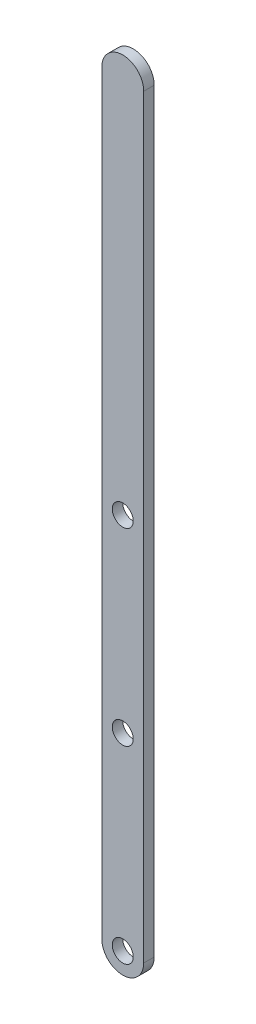
ISO-10303-21;
HEADER;
FILE_DESCRIPTION(('STEP AP214'),'2;1');
FILE_NAME('part.step','',(''),(''),'','','');
FILE_SCHEMA(('AUTOMOTIVE_DESIGN { 1 0 10303 214 1 1 1 1 }'));
ENDSEC;
DATA;
#1=APPLICATION_CONTEXT('core data for automotive mechanical design processes');
#2=APPLICATION_PROTOCOL_DEFINITION('international standard','automotive_design',2000,#1);
#3=PRODUCT_CONTEXT('',#1,'mechanical');
#4=PRODUCT('Part','Part','',(#3));
#5=PRODUCT_RELATED_PRODUCT_CATEGORY('part','',(#4));
#6=PRODUCT_DEFINITION_FORMATION('','',#4);
#7=PRODUCT_DEFINITION_CONTEXT('part definition',#1,'design');
#8=PRODUCT_DEFINITION('design','',#6,#7);
#9=PRODUCT_DEFINITION_SHAPE('','',#8);
#10=(LENGTH_UNIT() NAMED_UNIT(*) SI_UNIT(.MILLI.,.METRE.));
#11=(NAMED_UNIT(*) PLANE_ANGLE_UNIT() SI_UNIT($,.RADIAN.));
#12=(NAMED_UNIT(*) SI_UNIT($,.STERADIAN.) SOLID_ANGLE_UNIT());
#13=UNCERTAINTY_MEASURE_WITH_UNIT(LENGTH_MEASURE(1.E-05),#10,'distance_accuracy_value','');
#14=(GEOMETRIC_REPRESENTATION_CONTEXT(3) GLOBAL_UNCERTAINTY_ASSIGNED_CONTEXT((#13)) GLOBAL_UNIT_ASSIGNED_CONTEXT((#10,
#11,#12)) REPRESENTATION_CONTEXT('',''));
#15=CARTESIAN_POINT('',(0.,0.,0.));
#16=DIRECTION('',(0.,0.,1.));
#17=DIRECTION('',(1.,0.,0.));
#18=AXIS2_PLACEMENT_3D('',#15,#16,#17);
#19=CARTESIAN_POINT('',(0.,-457.2,12.7));
#20=DIRECTION('',(0.,0.,1.));
#21=DIRECTION('',(1.,0.,0.));
#22=AXIS2_PLACEMENT_3D('',#19,#20,#21);
#23=PLANE('',#22);
#24=CARTESIAN_POINT('',(0.,-457.2,12.7));
#25=DIRECTION('',(0.,0.,1.));
#26=DIRECTION('',(1.,0.,0.));
#27=AXIS2_PLACEMENT_3D('',#24,#25,#26);
#28=CIRCLE('',#27,12.7);
#29=CARTESIAN_POINT('',(12.7,-457.2,12.7));
#30=VERTEX_POINT('',#29);
#31=EDGE_CURVE('E125',#30,#30,#28,.T.);
#32=ORIENTED_EDGE('',*,*,#31,.F.);
#33=EDGE_LOOP('',(#32));
#34=FACE_BOUND('',#33,.T.);
#35=CARTESIAN_POINT('',(0.,-457.2,12.7));
#36=DIRECTION('',(0.,0.,1.));
#37=DIRECTION('',(1.,0.,0.));
#38=AXIS2_PLACEMENT_3D('',#35,#36,#37);
#39=CIRCLE('',#38,25.3999999999999);
#40=CARTESIAN_POINT('',(-25.3999999999999,-457.2,12.7));
#41=VERTEX_POINT('',#40);
#42=CARTESIAN_POINT('',(25.3999999999999,-457.2,12.7));
#43=VERTEX_POINT('',#42);
#44=EDGE_CURVE('E91',#41,#43,#39,.T.);
#45=ORIENTED_EDGE('',*,*,#44,.T.);
#46=DIRECTION('',(0.,1.,0.));
#47=VECTOR('',#46,1.);
#48=CARTESIAN_POINT('',(25.3999999999999,0.,12.7));
#49=LINE('',#48,#47);
#50=CARTESIAN_POINT('',(25.3999999999999,457.2,12.7));
#51=VERTEX_POINT('',#50);
#52=EDGE_CURVE('E85',#43,#51,#49,.T.);
#53=ORIENTED_EDGE('',*,*,#52,.T.);
#54=CARTESIAN_POINT('',(0.,457.2,12.7));
#55=DIRECTION('',(0.,0.,1.));
#56=DIRECTION('',(1.,0.,0.));
#57=AXIS2_PLACEMENT_3D('',#54,#55,#56);
#58=CIRCLE('',#57,25.3999999999999);
#59=CARTESIAN_POINT('',(-25.3999999999999,457.2,12.7));
#60=VERTEX_POINT('',#59);
#61=EDGE_CURVE('E88',#51,#60,#58,.T.);
#62=ORIENTED_EDGE('',*,*,#61,.T.);
#63=DIRECTION('',(0.,-1.,0.));
#64=VECTOR('',#63,1.);
#65=CARTESIAN_POINT('',(-25.3999999999999,0.,12.7));
#66=LINE('',#65,#64);
#67=EDGE_CURVE('E57',#60,#41,#66,.T.);
#68=ORIENTED_EDGE('',*,*,#67,.T.);
#69=EDGE_LOOP('',(#45,#53,#62,#68));
#70=FACE_BOUND('',#69,.T.);
#71=CARTESIAN_POINT('',(0.,0.,12.7));
#72=DIRECTION('',(0.,0.,1.));
#73=DIRECTION('',(1.,0.,0.));
#74=AXIS2_PLACEMENT_3D('',#71,#72,#73);
#75=CIRCLE('',#74,12.7);
#76=CARTESIAN_POINT('',(12.7,0.,12.7));
#77=VERTEX_POINT('',#76);
#78=EDGE_CURVE('E110',#77,#77,#75,.T.);
#79=ORIENTED_EDGE('',*,*,#78,.F.);
#80=EDGE_LOOP('',(#79));
#81=FACE_BOUND('',#80,.T.);
#82=CARTESIAN_POINT('',(0.,-228.6,12.7));
#83=DIRECTION('',(0.,0.,1.));
#84=DIRECTION('',(1.,0.,0.));
#85=AXIS2_PLACEMENT_3D('',#82,#83,#84);
#86=CIRCLE('',#85,12.7);
#87=CARTESIAN_POINT('',(12.7,-228.6,12.7));
#88=VERTEX_POINT('',#87);
#89=EDGE_CURVE('E132',#88,#88,#86,.T.);
#90=ORIENTED_EDGE('',*,*,#89,.F.);
#91=EDGE_LOOP('',(#90));
#92=FACE_BOUND('',#91,.T.);
#93=ADVANCED_FACE('F40',(#34,#70,#81,#92),#23,.T.);
#94=CARTESIAN_POINT('',(0.,-457.2,0.));
#95=DIRECTION('',(0.,0.,1.));
#96=DIRECTION('',(1.,0.,0.));
#97=AXIS2_PLACEMENT_3D('',#94,#95,#96);
#98=PLANE('',#97);
#99=CARTESIAN_POINT('',(0.,-457.2,0.));
#100=DIRECTION('',(0.,0.,1.));
#101=DIRECTION('',(1.,0.,0.));
#102=AXIS2_PLACEMENT_3D('',#99,#100,#101);
#103=CIRCLE('',#102,25.3999999999999);
#104=CARTESIAN_POINT('',(-25.3999999999999,-457.2,0.));
#105=VERTEX_POINT('',#104);
#106=CARTESIAN_POINT('',(25.3999999999999,-457.2,0.));
#107=VERTEX_POINT('',#106);
#108=EDGE_CURVE('E107',#105,#107,#103,.T.);
#109=ORIENTED_EDGE('',*,*,#108,.F.);
#110=DIRECTION('',(0.,-1.,0.));
#111=VECTOR('',#110,1.);
#112=CARTESIAN_POINT('',(-25.3999999999999,-457.2,0.));
#113=LINE('',#112,#111);
#114=CARTESIAN_POINT('',(-25.3999999999999,457.2,0.));
#115=VERTEX_POINT('',#114);
#116=EDGE_CURVE('E74',#115,#105,#113,.T.);
#117=ORIENTED_EDGE('',*,*,#116,.F.);
#118=CARTESIAN_POINT('',(0.,457.2,0.));
#119=DIRECTION('',(0.,0.,1.));
#120=DIRECTION('',(1.,0.,0.));
#121=AXIS2_PLACEMENT_3D('',#118,#119,#120);
#122=CIRCLE('',#121,25.3999999999999);
#123=CARTESIAN_POINT('',(25.3999999999999,457.2,0.));
#124=VERTEX_POINT('',#123);
#125=EDGE_CURVE('E113',#124,#115,#122,.T.);
#126=ORIENTED_EDGE('',*,*,#125,.F.);
#127=DIRECTION('',(0.,1.,0.));
#128=VECTOR('',#127,1.);
#129=CARTESIAN_POINT('',(25.3999999999999,0.,0.));
#130=LINE('',#129,#128);
#131=EDGE_CURVE('E97',#107,#124,#130,.T.);
#132=ORIENTED_EDGE('',*,*,#131,.F.);
#133=EDGE_LOOP('',(#109,#117,#126,#132));
#134=FACE_BOUND('',#133,.T.);
#135=CARTESIAN_POINT('',(0.,0.,0.));
#136=DIRECTION('',(0.,0.,1.));
#137=DIRECTION('',(1.,0.,0.));
#138=AXIS2_PLACEMENT_3D('',#135,#136,#137);
#139=CIRCLE('',#138,12.7);
#140=CARTESIAN_POINT('',(12.7,0.,0.));
#141=VERTEX_POINT('',#140);
#142=EDGE_CURVE('E121',#141,#141,#139,.T.);
#143=ORIENTED_EDGE('',*,*,#142,.T.);
#144=EDGE_LOOP('',(#143));
#145=FACE_BOUND('',#144,.T.);
#146=CARTESIAN_POINT('',(0.,-457.2,0.));
#147=DIRECTION('',(0.,0.,1.));
#148=DIRECTION('',(1.,0.,0.));
#149=AXIS2_PLACEMENT_3D('',#146,#147,#148);
#150=CIRCLE('',#149,12.7);
#151=CARTESIAN_POINT('',(12.7,-457.2,0.));
#152=VERTEX_POINT('',#151);
#153=EDGE_CURVE('E129',#152,#152,#150,.T.);
#154=ORIENTED_EDGE('',*,*,#153,.T.);
#155=EDGE_LOOP('',(#154));
#156=FACE_BOUND('',#155,.T.);
#157=CARTESIAN_POINT('',(0.,-228.6,0.));
#158=DIRECTION('',(0.,0.,1.));
#159=DIRECTION('',(1.,0.,0.));
#160=AXIS2_PLACEMENT_3D('',#157,#158,#159);
#161=CIRCLE('',#160,12.7);
#162=CARTESIAN_POINT('',(12.7,-228.6,0.));
#163=VERTEX_POINT('',#162);
#164=EDGE_CURVE('E135',#163,#163,#161,.T.);
#165=ORIENTED_EDGE('',*,*,#164,.T.);
#166=EDGE_LOOP('',(#165));
#167=FACE_BOUND('',#166,.T.);
#168=ADVANCED_FACE('F145',(#134,#145,#156,#167),#98,.F.);
#169=CARTESIAN_POINT('',(0.,-457.2,12.7));
#170=DIRECTION('',(0.,0.,-1.));
#171=DIRECTION('',(-1.,0.,0.));
#172=AXIS2_PLACEMENT_3D('',#169,#170,#171);
#173=CYLINDRICAL_SURFACE('',#172,25.3999999999999);
#174=ORIENTED_EDGE('',*,*,#108,.T.);
#175=DIRECTION('',(0.,0.,-1.));
#176=VECTOR('',#175,1.);
#177=CARTESIAN_POINT('',(25.3999999999999,-457.2,12.7));
#178=LINE('',#177,#176);
#179=EDGE_CURVE('E11',#43,#107,#178,.T.);
#180=ORIENTED_EDGE('',*,*,#179,.F.);
#181=ORIENTED_EDGE('',*,*,#44,.F.);
#182=DIRECTION('',(0.,0.,-1.));
#183=VECTOR('',#182,1.);
#184=CARTESIAN_POINT('',(-25.3999999999999,-457.2,12.7));
#185=LINE('',#184,#183);
#186=EDGE_CURVE('E103',#41,#105,#185,.T.);
#187=ORIENTED_EDGE('',*,*,#186,.T.);
#188=EDGE_LOOP('',(#174,#180,#181,#187));
#189=FACE_BOUND('',#188,.T.);
#190=ADVANCED_FACE('F42',(#189),#173,.T.);
#191=CARTESIAN_POINT('',(25.3999999999999,0.,12.7));
#192=DIRECTION('',(-1.,0.,0.));
#193=DIRECTION('',(0.,-1.,0.));
#194=AXIS2_PLACEMENT_3D('',#191,#192,#193);
#195=PLANE('',#194);
#196=ORIENTED_EDGE('',*,*,#131,.T.);
#197=DIRECTION('',(0.,0.,-1.));
#198=VECTOR('',#197,1.);
#199=CARTESIAN_POINT('',(25.3999999999999,457.2,12.7));
#200=LINE('',#199,#198);
#201=EDGE_CURVE('E49',#51,#124,#200,.T.);
#202=ORIENTED_EDGE('',*,*,#201,.F.);
#203=ORIENTED_EDGE('',*,*,#52,.F.);
#204=ORIENTED_EDGE('',*,*,#179,.T.);
#205=EDGE_LOOP('',(#196,#202,#203,#204));
#206=FACE_BOUND('',#205,.T.);
#207=ADVANCED_FACE('F96',(#206),#195,.F.);
#208=CARTESIAN_POINT('',(0.,457.2,12.7));
#209=DIRECTION('',(0.,0.,-1.));
#210=DIRECTION('',(-1.,0.,0.));
#211=AXIS2_PLACEMENT_3D('',#208,#209,#210);
#212=CYLINDRICAL_SURFACE('',#211,25.3999999999999);
#213=ORIENTED_EDGE('',*,*,#125,.T.);
#214=DIRECTION('',(0.,0.,-1.));
#215=VECTOR('',#214,1.);
#216=CARTESIAN_POINT('',(-25.3999999999999,457.2,12.7));
#217=LINE('',#216,#215);
#218=EDGE_CURVE('E99',#60,#115,#217,.T.);
#219=ORIENTED_EDGE('',*,*,#218,.F.);
#220=ORIENTED_EDGE('',*,*,#61,.F.);
#221=ORIENTED_EDGE('',*,*,#201,.T.);
#222=EDGE_LOOP('',(#213,#219,#220,#221));
#223=FACE_BOUND('',#222,.T.);
#224=ADVANCED_FACE('F100',(#223),#212,.T.);
#225=CARTESIAN_POINT('',(-25.3999999999999,-457.2,12.7));
#226=DIRECTION('',(1.,0.,0.));
#227=DIRECTION('',(0.,1.,0.));
#228=AXIS2_PLACEMENT_3D('',#225,#226,#227);
#229=PLANE('',#228);
#230=ORIENTED_EDGE('',*,*,#116,.T.);
#231=ORIENTED_EDGE('',*,*,#186,.F.);
#232=ORIENTED_EDGE('',*,*,#67,.F.);
#233=ORIENTED_EDGE('',*,*,#218,.T.);
#234=EDGE_LOOP('',(#230,#231,#232,#233));
#235=FACE_BOUND('',#234,.T.);
#236=ADVANCED_FACE('F118',(#235),#229,.F.);
#237=CARTESIAN_POINT('',(0.,0.,12.7));
#238=DIRECTION('',(0.,0.,-1.));
#239=DIRECTION('',(-1.,0.,0.));
#240=AXIS2_PLACEMENT_3D('',#237,#238,#239);
#241=CYLINDRICAL_SURFACE('',#240,12.7);
#242=ORIENTED_EDGE('',*,*,#78,.T.);
#243=EDGE_LOOP('',(#242));
#244=FACE_BOUND('',#243,.T.);
#245=ORIENTED_EDGE('',*,*,#142,.F.);
#246=EDGE_LOOP('',(#245));
#247=FACE_BOUND('',#246,.T.);
#248=ADVANCED_FACE('F154',(#244,#247),#241,.F.);
#249=CARTESIAN_POINT('',(0.,-457.2,12.7));
#250=DIRECTION('',(0.,0.,-1.));
#251=DIRECTION('',(-1.,0.,0.));
#252=AXIS2_PLACEMENT_3D('',#249,#250,#251);
#253=CYLINDRICAL_SURFACE('',#252,12.7);
#254=ORIENTED_EDGE('',*,*,#31,.T.);
#255=EDGE_LOOP('',(#254));
#256=FACE_BOUND('',#255,.T.);
#257=ORIENTED_EDGE('',*,*,#153,.F.);
#258=EDGE_LOOP('',(#257));
#259=FACE_BOUND('',#258,.T.);
#260=ADVANCED_FACE('F206',(#256,#259),#253,.F.);
#261=CARTESIAN_POINT('',(0.,-228.6,12.7));
#262=DIRECTION('',(0.,0.,-1.));
#263=DIRECTION('',(-1.,0.,0.));
#264=AXIS2_PLACEMENT_3D('',#261,#262,#263);
#265=CYLINDRICAL_SURFACE('',#264,12.7);
#266=ORIENTED_EDGE('',*,*,#89,.T.);
#267=EDGE_LOOP('',(#266));
#268=FACE_BOUND('',#267,.T.);
#269=ORIENTED_EDGE('',*,*,#164,.F.);
#270=EDGE_LOOP('',(#269));
#271=FACE_BOUND('',#270,.T.);
#272=ADVANCED_FACE('F141',(#268,#271),#265,.F.);
#273=CLOSED_SHELL('',(#93,#168,#190,#207,#224,#236,#248,#260,#272));
#274=MANIFOLD_SOLID_BREP('B2',#273);
#275=ADVANCED_BREP_SHAPE_REPRESENTATION('',(#18,#274),#14);
#276=SHAPE_DEFINITION_REPRESENTATION(#9,#275);
ENDSEC;
END-ISO-10303-21;
